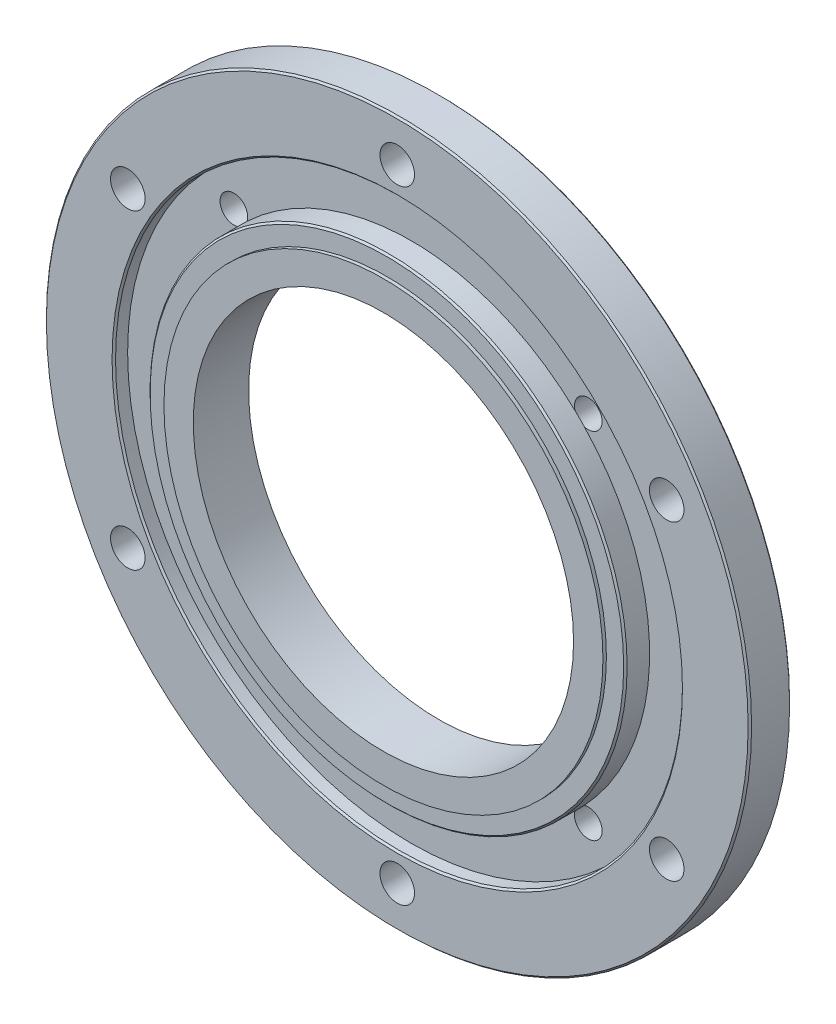
ISO-10303-21;
HEADER;
FILE_DESCRIPTION(('STEP AP214'),'2;1');
FILE_NAME('part.step','',(''),(''),'','','');
FILE_SCHEMA(('AUTOMOTIVE_DESIGN { 1 0 10303 214 1 1 1 1 }'));
ENDSEC;
DATA;
#1=APPLICATION_CONTEXT('core data for automotive mechanical design processes');
#2=APPLICATION_PROTOCOL_DEFINITION('international standard','automotive_design',2000,#1);
#3=PRODUCT_CONTEXT('',#1,'mechanical');
#4=PRODUCT('Part','Part','',(#3));
#5=PRODUCT_RELATED_PRODUCT_CATEGORY('part','',(#4));
#6=PRODUCT_DEFINITION_FORMATION('','',#4);
#7=PRODUCT_DEFINITION_CONTEXT('part definition',#1,'design');
#8=PRODUCT_DEFINITION('design','',#6,#7);
#9=PRODUCT_DEFINITION_SHAPE('','',#8);
#10=(LENGTH_UNIT() NAMED_UNIT(*) SI_UNIT(.MILLI.,.METRE.));
#11=(NAMED_UNIT(*) PLANE_ANGLE_UNIT() SI_UNIT($,.RADIAN.));
#12=(NAMED_UNIT(*) SI_UNIT($,.STERADIAN.) SOLID_ANGLE_UNIT());
#13=UNCERTAINTY_MEASURE_WITH_UNIT(LENGTH_MEASURE(1.E-05),#10,'distance_accuracy_value','');
#14=(GEOMETRIC_REPRESENTATION_CONTEXT(3) GLOBAL_UNCERTAINTY_ASSIGNED_CONTEXT((#13)) GLOBAL_UNIT_ASSIGNED_CONTEXT((#10,
#11,#12)) REPRESENTATION_CONTEXT('',''));
#15=CARTESIAN_POINT('',(0.,0.,0.));
#16=DIRECTION('',(0.,0.,1.));
#17=DIRECTION('',(1.,0.,0.));
#18=AXIS2_PLACEMENT_3D('',#15,#16,#17);
#19=CARTESIAN_POINT('',(0.,0.,12.));
#20=DIRECTION('',(0.,0.,-1.));
#21=DIRECTION('',(-1.,0.,0.));
#22=AXIS2_PLACEMENT_3D('',#19,#20,#21);
#23=CYLINDRICAL_SURFACE('',#22,102.);
#24=CARTESIAN_POINT('',(0.,0.,0.500000000000028));
#25=DIRECTION('',(0.,0.,1.));
#26=DIRECTION('',(1.,0.,0.));
#27=AXIS2_PLACEMENT_3D('',#24,#25,#26);
#28=CIRCLE('',#27,102.);
#29=CARTESIAN_POINT('',(102.,0.,0.500000000000028));
#30=VERTEX_POINT('',#29);
#31=EDGE_CURVE('E130',#30,#30,#28,.T.);
#32=ORIENTED_EDGE('',*,*,#31,.T.);
#33=EDGE_LOOP('',(#32));
#34=FACE_BOUND('',#33,.T.);
#35=CARTESIAN_POINT('',(0.,0.,11.5));
#36=DIRECTION('',(0.,0.,1.));
#37=DIRECTION('',(1.,0.,0.));
#38=AXIS2_PLACEMENT_3D('',#35,#36,#37);
#39=CIRCLE('',#38,102.);
#40=CARTESIAN_POINT('',(102.,0.,11.5));
#41=VERTEX_POINT('',#40);
#42=EDGE_CURVE('E127',#41,#41,#39,.F.);
#43=ORIENTED_EDGE('',*,*,#42,.T.);
#44=EDGE_LOOP('',(#43));
#45=FACE_BOUND('',#44,.T.);
#46=ADVANCED_FACE('F37',(#34,#45),#23,.T.);
#47=CARTESIAN_POINT('',(0.,0.,12.));
#48=DIRECTION('',(0.,0.,1.));
#49=DIRECTION('',(1.,0.,0.));
#50=AXIS2_PLACEMENT_3D('',#47,#48,#49);
#51=PLANE('',#50);
#52=CARTESIAN_POINT('',(0.,0.,12.));
#53=DIRECTION('',(0.,0.,1.));
#54=DIRECTION('',(1.,0.,0.));
#55=AXIS2_PLACEMENT_3D('',#52,#53,#54);
#56=CIRCLE('',#55,82.5);
#57=CARTESIAN_POINT('',(82.5,0.,12.));
#58=VERTEX_POINT('',#57);
#59=EDGE_CURVE('E142',#58,#58,#56,.F.);
#60=ORIENTED_EDGE('',*,*,#59,.T.);
#61=EDGE_LOOP('',(#60));
#62=FACE_BOUND('',#61,.T.);
#63=CARTESIAN_POINT('',(0.,0.,12.));
#64=DIRECTION('',(0.,0.,1.));
#65=DIRECTION('',(1.,0.,0.));
#66=AXIS2_PLACEMENT_3D('',#63,#64,#65);
#67=CIRCLE('',#66,101.5);
#68=CARTESIAN_POINT('',(101.5,0.,12.));
#69=VERTEX_POINT('',#68);
#70=EDGE_CURVE('E139',#69,#69,#67,.T.);
#71=ORIENTED_EDGE('',*,*,#70,.T.);
#72=EDGE_LOOP('',(#71));
#73=FACE_BOUND('',#72,.T.);
#74=CARTESIAN_POINT('',(77.9422863405993,-45.0000000000003,12.));
#75=DIRECTION('',(0.,0.,1.));
#76=DIRECTION('',(1.,0.,0.));
#77=AXIS2_PLACEMENT_3D('',#74,#75,#76);
#78=CIRCLE('',#77,4.99999999999999);
#79=CARTESIAN_POINT('',(82.9422863405993,-45.0000000000003,12.));
#80=VERTEX_POINT('',#79);
#81=EDGE_CURVE('E344',#80,#80,#78,.T.);
#82=ORIENTED_EDGE('',*,*,#81,.F.);
#83=EDGE_LOOP('',(#82));
#84=FACE_BOUND('',#83,.T.);
#85=CARTESIAN_POINT('',(-2.70616862252382E-13,-90.,12.));
#86=DIRECTION('',(0.,0.,1.));
#87=DIRECTION('',(1.,0.,0.));
#88=AXIS2_PLACEMENT_3D('',#85,#86,#87);
#89=CIRCLE('',#88,5.00000000000001);
#90=CARTESIAN_POINT('',(4.99999999999974,-90.,12.));
#91=VERTEX_POINT('',#90);
#92=EDGE_CURVE('E341',#91,#91,#89,.T.);
#93=ORIENTED_EDGE('',*,*,#92,.F.);
#94=EDGE_LOOP('',(#93));
#95=FACE_BOUND('',#94,.T.);
#96=CARTESIAN_POINT('',(-77.9422863405996,-44.9999999999998,12.));
#97=DIRECTION('',(0.,0.,1.));
#98=DIRECTION('',(1.,0.,0.));
#99=AXIS2_PLACEMENT_3D('',#96,#97,#98);
#100=CIRCLE('',#99,5.00000000000001);
#101=CARTESIAN_POINT('',(-72.9422863405996,-44.9999999999998,12.));
#102=VERTEX_POINT('',#101);
#103=EDGE_CURVE('E338',#102,#102,#100,.T.);
#104=ORIENTED_EDGE('',*,*,#103,.F.);
#105=EDGE_LOOP('',(#104));
#106=FACE_BOUND('',#105,.T.);
#107=CARTESIAN_POINT('',(-77.9422863405994,45.0000000000002,12.));
#108=DIRECTION('',(0.,0.,1.));
#109=DIRECTION('',(1.,0.,0.));
#110=AXIS2_PLACEMENT_3D('',#107,#108,#109);
#111=CIRCLE('',#110,5.00000000000001);
#112=CARTESIAN_POINT('',(-72.9422863405994,45.0000000000002,12.));
#113=VERTEX_POINT('',#112);
#114=EDGE_CURVE('E335',#113,#113,#111,.T.);
#115=ORIENTED_EDGE('',*,*,#114,.F.);
#116=EDGE_LOOP('',(#115));
#117=FACE_BOUND('',#116,.T.);
#118=CARTESIAN_POINT('',(2.63677968348475E-13,90.,12.));
#119=DIRECTION('',(0.,0.,1.));
#120=DIRECTION('',(1.,0.,0.));
#121=AXIS2_PLACEMENT_3D('',#118,#119,#120);
#122=CIRCLE('',#121,5.00000000000001);
#123=CARTESIAN_POINT('',(5.00000000000027,90.,12.));
#124=VERTEX_POINT('',#123);
#125=EDGE_CURVE('E323',#124,#124,#122,.T.);
#126=ORIENTED_EDGE('',*,*,#125,.F.);
#127=EDGE_LOOP('',(#126));
#128=FACE_BOUND('',#127,.T.);
#129=CARTESIAN_POINT('',(77.9422863405996,44.9999999999998,12.));
#130=DIRECTION('',(0.,0.,1.));
#131=DIRECTION('',(1.,0.,0.));
#132=AXIS2_PLACEMENT_3D('',#129,#130,#131);
#133=CIRCLE('',#132,5.00000000000003);
#134=CARTESIAN_POINT('',(82.9422863405996,44.9999999999998,12.));
#135=VERTEX_POINT('',#134);
#136=EDGE_CURVE('E325',#135,#135,#133,.T.);
#137=ORIENTED_EDGE('',*,*,#136,.F.);
#138=EDGE_LOOP('',(#137));
#139=FACE_BOUND('',#138,.T.);
#140=ADVANCED_FACE('F165',(#62,#73,#84,#95,#106,#117,#128,#139),#51,.T.);
#141=CARTESIAN_POINT('',(0.,0.,0.));
#142=DIRECTION('',(0.,0.,1.));
#143=DIRECTION('',(1.,0.,0.));
#144=AXIS2_PLACEMENT_3D('',#141,#142,#143);
#145=PLANE('',#144);
#146=CARTESIAN_POINT('',(0.,0.,0.));
#147=DIRECTION('',(0.,0.,1.));
#148=DIRECTION('',(1.,0.,0.));
#149=AXIS2_PLACEMENT_3D('',#146,#147,#148);
#150=CIRCLE('',#149,101.5);
#151=CARTESIAN_POINT('',(101.5,0.,0.));
#152=VERTEX_POINT('',#151);
#153=EDGE_CURVE('E133',#152,#152,#150,.F.);
#154=ORIENTED_EDGE('',*,*,#153,.T.);
#155=EDGE_LOOP('',(#154));
#156=FACE_BOUND('',#155,.T.);
#157=CARTESIAN_POINT('',(77.9422863405993,-45.0000000000003,0.));
#158=DIRECTION('',(0.,0.,-1.));
#159=DIRECTION('',(-1.,0.,0.));
#160=AXIS2_PLACEMENT_3D('',#157,#158,#159);
#161=CIRCLE('',#160,4.99999999999999);
#162=CARTESIAN_POINT('',(72.9422863405994,-45.0000000000003,0.));
#163=VERTEX_POINT('',#162);
#164=EDGE_CURVE('E205',#163,#163,#161,.T.);
#165=ORIENTED_EDGE('',*,*,#164,.F.);
#166=EDGE_LOOP('',(#165));
#167=FACE_BOUND('',#166,.T.);
#168=CARTESIAN_POINT('',(-2.70616862252382E-13,-90.,0.));
#169=DIRECTION('',(0.,0.,-1.));
#170=DIRECTION('',(-1.,0.,0.));
#171=AXIS2_PLACEMENT_3D('',#168,#169,#170);
#172=CIRCLE('',#171,5.00000000000001);
#173=CARTESIAN_POINT('',(-5.00000000000028,-90.,0.));
#174=VERTEX_POINT('',#173);
#175=EDGE_CURVE('E209',#174,#174,#172,.T.);
#176=ORIENTED_EDGE('',*,*,#175,.F.);
#177=EDGE_LOOP('',(#176));
#178=FACE_BOUND('',#177,.T.);
#179=CARTESIAN_POINT('',(-77.9422863405996,-44.9999999999998,0.));
#180=DIRECTION('',(0.,0.,-1.));
#181=DIRECTION('',(-1.,0.,0.));
#182=AXIS2_PLACEMENT_3D('',#179,#180,#181);
#183=CIRCLE('',#182,5.00000000000001);
#184=CARTESIAN_POINT('',(-82.9422863405996,-44.9999999999998,0.));
#185=VERTEX_POINT('',#184);
#186=EDGE_CURVE('E213',#185,#185,#183,.T.);
#187=ORIENTED_EDGE('',*,*,#186,.F.);
#188=EDGE_LOOP('',(#187));
#189=FACE_BOUND('',#188,.T.);
#190=CARTESIAN_POINT('',(-77.9422863405994,45.0000000000002,0.));
#191=DIRECTION('',(0.,0.,-1.));
#192=DIRECTION('',(-1.,0.,0.));
#193=AXIS2_PLACEMENT_3D('',#190,#191,#192);
#194=CIRCLE('',#193,5.00000000000001);
#195=CARTESIAN_POINT('',(-82.9422863405994,45.0000000000002,0.));
#196=VERTEX_POINT('',#195);
#197=EDGE_CURVE('E217',#196,#196,#194,.T.);
#198=ORIENTED_EDGE('',*,*,#197,.F.);
#199=EDGE_LOOP('',(#198));
#200=FACE_BOUND('',#199,.T.);
#201=CARTESIAN_POINT('',(2.63677968348475E-13,90.,0.));
#202=DIRECTION('',(0.,0.,-1.));
#203=DIRECTION('',(-1.,0.,0.));
#204=AXIS2_PLACEMENT_3D('',#201,#202,#203);
#205=CIRCLE('',#204,5.00000000000001);
#206=CARTESIAN_POINT('',(-4.99999999999974,90.,0.));
#207=VERTEX_POINT('',#206);
#208=EDGE_CURVE('E221',#207,#207,#205,.T.);
#209=ORIENTED_EDGE('',*,*,#208,.F.);
#210=EDGE_LOOP('',(#209));
#211=FACE_BOUND('',#210,.T.);
#212=CARTESIAN_POINT('',(77.9422863405996,44.9999999999998,0.));
#213=DIRECTION('',(0.,0.,-1.));
#214=DIRECTION('',(-1.,0.,0.));
#215=AXIS2_PLACEMENT_3D('',#212,#213,#214);
#216=CIRCLE('',#215,5.00000000000003);
#217=CARTESIAN_POINT('',(72.9422863405996,44.9999999999998,0.));
#218=VERTEX_POINT('',#217);
#219=EDGE_CURVE('E225',#218,#218,#216,.T.);
#220=ORIENTED_EDGE('',*,*,#219,.F.);
#221=EDGE_LOOP('',(#220));
#222=FACE_BOUND('',#221,.T.);
#223=CARTESIAN_POINT('',(-51.2652416360248,-51.2652416360246,0.));
#224=DIRECTION('',(0.,0.,1.));
#225=DIRECTION('',(-1.,0.,0.));
#226=AXIS2_PLACEMENT_3D('',#223,#224,#225);
#227=CIRCLE('',#226,4.);
#228=CARTESIAN_POINT('',(-55.2652416360248,-51.2652416360246,0.));
#229=VERTEX_POINT('',#228);
#230=EDGE_CURVE('E229',#229,#229,#227,.T.);
#231=ORIENTED_EDGE('',*,*,#230,.T.);
#232=EDGE_LOOP('',(#231));
#233=FACE_BOUND('',#232,.T.);
#234=CARTESIAN_POINT('',(51.2652416360248,-51.2652416360246,0.));
#235=DIRECTION('',(0.,0.,1.));
#236=DIRECTION('',(1.,0.,0.));
#237=AXIS2_PLACEMENT_3D('',#234,#235,#236);
#238=CIRCLE('',#237,4.);
#239=CARTESIAN_POINT('',(55.2652416360248,-51.2652416360246,0.));
#240=VERTEX_POINT('',#239);
#241=EDGE_CURVE('E233',#240,#240,#238,.T.);
#242=ORIENTED_EDGE('',*,*,#241,.T.);
#243=EDGE_LOOP('',(#242));
#244=FACE_BOUND('',#243,.T.);
#245=CARTESIAN_POINT('',(51.2652416360248,51.2652416360246,0.));
#246=DIRECTION('',(0.,0.,1.));
#247=DIRECTION('',(-1.,0.,0.));
#248=AXIS2_PLACEMENT_3D('',#245,#246,#247);
#249=CIRCLE('',#248,4.);
#250=CARTESIAN_POINT('',(47.2652416360248,51.2652416360246,0.));
#251=VERTEX_POINT('',#250);
#252=EDGE_CURVE('E237',#251,#251,#249,.T.);
#253=ORIENTED_EDGE('',*,*,#252,.T.);
#254=EDGE_LOOP('',(#253));
#255=FACE_BOUND('',#254,.T.);
#256=CARTESIAN_POINT('',(-51.2652416360248,51.2652416360246,0.));
#257=DIRECTION('',(0.,0.,1.));
#258=DIRECTION('',(1.,0.,0.));
#259=AXIS2_PLACEMENT_3D('',#256,#257,#258);
#260=CIRCLE('',#259,4.);
#261=CARTESIAN_POINT('',(-47.2652416360248,51.2652416360246,0.));
#262=VERTEX_POINT('',#261);
#263=EDGE_CURVE('E88',#262,#262,#260,.T.);
#264=ORIENTED_EDGE('',*,*,#263,.T.);
#265=EDGE_LOOP('',(#264));
#266=FACE_BOUND('',#265,.T.);
#267=CARTESIAN_POINT('',(0.,0.,0.));
#268=DIRECTION('',(0.,0.,1.));
#269=DIRECTION('',(1.,0.,0.));
#270=AXIS2_PLACEMENT_3D('',#267,#268,#269);
#271=CIRCLE('',#270,55.);
#272=CARTESIAN_POINT('',(55.,0.,0.));
#273=VERTEX_POINT('',#272);
#274=EDGE_CURVE('E116',#273,#273,#271,.T.);
#275=ORIENTED_EDGE('',*,*,#274,.T.);
#276=EDGE_LOOP('',(#275));
#277=FACE_BOUND('',#276,.T.);
#278=ADVANCED_FACE('F171',(#156,#167,#178,#189,#200,#211,#222,#233,#244,#255,#266,#277),#145,.F.);
#279=CARTESIAN_POINT('',(0.,0.,15.));
#280=DIRECTION('',(0.,0.,-1.));
#281=DIRECTION('',(-1.,0.,0.));
#282=AXIS2_PLACEMENT_3D('',#279,#280,#281);
#283=CYLINDRICAL_SURFACE('',#282,69.);
#284=CARTESIAN_POINT('',(0.,0.,14.5));
#285=DIRECTION('',(0.,0.,1.));
#286=DIRECTION('',(1.,0.,0.));
#287=AXIS2_PLACEMENT_3D('',#284,#285,#286);
#288=CIRCLE('',#287,69.);
#289=CARTESIAN_POINT('',(69.,0.,14.5));
#290=VERTEX_POINT('',#289);
#291=EDGE_CURVE('E11',#290,#290,#288,.F.);
#292=ORIENTED_EDGE('',*,*,#291,.T.);
#293=EDGE_LOOP('',(#292));
#294=FACE_BOUND('',#293,.T.);
#295=CARTESIAN_POINT('',(0.,0.,8.));
#296=DIRECTION('',(0.,0.,1.));
#297=DIRECTION('',(1.,0.,0.));
#298=AXIS2_PLACEMENT_3D('',#295,#296,#297);
#299=CIRCLE('',#298,69.);
#300=CARTESIAN_POINT('',(50.1078008135945,47.4363605014669,8.));
#301=VERTEX_POINT('',#300);
#302=CARTESIAN_POINT('',(47.4363605014671,50.1078008135943,8.));
#303=VERTEX_POINT('',#302);
#304=EDGE_CURVE('E109',#301,#303,#299,.T.);
#305=ORIENTED_EDGE('',*,*,#304,.T.);
#306=CARTESIAN_POINT('',(-47.4363605014671,50.1078008135943,8.));
#307=VERTEX_POINT('',#306);
#308=EDGE_CURVE('E108',#303,#307,#299,.T.);
#309=ORIENTED_EDGE('',*,*,#308,.T.);
#310=CARTESIAN_POINT('',(-50.1078008135945,47.4363605014669,8.));
#311=VERTEX_POINT('',#310);
#312=EDGE_CURVE('E93',#307,#311,#299,.T.);
#313=ORIENTED_EDGE('',*,*,#312,.T.);
#314=CARTESIAN_POINT('',(-50.1078008135945,-47.4363605014669,8.));
#315=VERTEX_POINT('',#314);
#316=EDGE_CURVE('E97',#311,#315,#299,.T.);
#317=ORIENTED_EDGE('',*,*,#316,.T.);
#318=CARTESIAN_POINT('',(-47.4363605014671,-50.1078008135943,8.));
#319=VERTEX_POINT('',#318);
#320=EDGE_CURVE('E104',#315,#319,#299,.T.);
#321=ORIENTED_EDGE('',*,*,#320,.T.);
#322=CARTESIAN_POINT('',(47.4363605014671,-50.1078008135943,8.));
#323=VERTEX_POINT('',#322);
#324=EDGE_CURVE('E358',#319,#323,#299,.T.);
#325=ORIENTED_EDGE('',*,*,#324,.T.);
#326=CARTESIAN_POINT('',(50.1078008135945,-47.4363605014669,8.));
#327=VERTEX_POINT('',#326);
#328=EDGE_CURVE('E361',#323,#327,#299,.T.);
#329=ORIENTED_EDGE('',*,*,#328,.T.);
#330=EDGE_CURVE('E94',#327,#301,#299,.T.);
#331=ORIENTED_EDGE('',*,*,#330,.T.);
#332=EDGE_LOOP('',(#305,#309,#313,#317,#321,#325,#329,#331));
#333=FACE_BOUND('',#332,.T.);
#334=ADVANCED_FACE('F107',(#294,#333),#283,.T.);
#335=CARTESIAN_POINT('',(0.,0.,15.));
#336=DIRECTION('',(0.,0.,1.));
#337=DIRECTION('',(1.,0.,0.));
#338=AXIS2_PLACEMENT_3D('',#335,#336,#337);
#339=PLANE('',#338);
#340=CARTESIAN_POINT('',(0.,0.,15.));
#341=DIRECTION('',(0.,0.,1.));
#342=DIRECTION('',(1.,0.,0.));
#343=AXIS2_PLACEMENT_3D('',#340,#341,#342);
#344=CIRCLE('',#343,68.5);
#345=CARTESIAN_POINT('',(68.5,0.,15.));
#346=VERTEX_POINT('',#345);
#347=EDGE_CURVE('E46',#346,#346,#344,.T.);
#348=ORIENTED_EDGE('',*,*,#347,.T.);
#349=EDGE_LOOP('',(#348));
#350=FACE_BOUND('',#349,.T.);
#351=CARTESIAN_POINT('',(0.,0.,15.));
#352=DIRECTION('',(0.,0.,1.));
#353=DIRECTION('',(1.,0.,0.));
#354=AXIS2_PLACEMENT_3D('',#351,#352,#353);
#355=CIRCLE('',#354,63.5);
#356=CARTESIAN_POINT('',(63.5,0.,15.));
#357=VERTEX_POINT('',#356);
#358=EDGE_CURVE('E124',#357,#357,#355,.T.);
#359=ORIENTED_EDGE('',*,*,#358,.F.);
#360=EDGE_LOOP('',(#359));
#361=FACE_BOUND('',#360,.T.);
#362=ADVANCED_FACE('F147',(#350,#361),#339,.T.);
#363=CARTESIAN_POINT('',(0.,0.,16.));
#364=DIRECTION('',(0.,0.,-1.));
#365=DIRECTION('',(-1.,0.,0.));
#366=AXIS2_PLACEMENT_3D('',#363,#364,#365);
#367=CYLINDRICAL_SURFACE('',#366,63.5);
#368=CARTESIAN_POINT('',(0.,0.,16.));
#369=DIRECTION('',(0.,0.,1.));
#370=DIRECTION('',(1.,0.,0.));
#371=AXIS2_PLACEMENT_3D('',#368,#369,#370);
#372=CIRCLE('',#371,63.5);
#373=CARTESIAN_POINT('',(63.5,0.,16.));
#374=VERTEX_POINT('',#373);
#375=EDGE_CURVE('E119',#374,#374,#372,.T.);
#376=ORIENTED_EDGE('',*,*,#375,.F.);
#377=EDGE_LOOP('',(#376));
#378=FACE_BOUND('',#377,.T.);
#379=ORIENTED_EDGE('',*,*,#358,.T.);
#380=EDGE_LOOP('',(#379));
#381=FACE_BOUND('',#380,.T.);
#382=ADVANCED_FACE('F253',(#378,#381),#367,.T.);
#383=CARTESIAN_POINT('',(0.,0.,16.));
#384=DIRECTION('',(0.,0.,1.));
#385=DIRECTION('',(1.,0.,0.));
#386=AXIS2_PLACEMENT_3D('',#383,#384,#385);
#387=PLANE('',#386);
#388=CARTESIAN_POINT('',(0.,0.,16.));
#389=DIRECTION('',(0.,0.,1.));
#390=DIRECTION('',(1.,0.,0.));
#391=AXIS2_PLACEMENT_3D('',#388,#389,#390);
#392=CIRCLE('',#391,55.);
#393=CARTESIAN_POINT('',(55.,0.,16.));
#394=VERTEX_POINT('',#393);
#395=EDGE_CURVE('E115',#394,#394,#392,.T.);
#396=ORIENTED_EDGE('',*,*,#395,.F.);
#397=EDGE_LOOP('',(#396));
#398=FACE_BOUND('',#397,.T.);
#399=ORIENTED_EDGE('',*,*,#375,.T.);
#400=EDGE_LOOP('',(#399));
#401=FACE_BOUND('',#400,.T.);
#402=ADVANCED_FACE('F247',(#398,#401),#387,.T.);
#403=CARTESIAN_POINT('',(0.,0.,0.));
#404=DIRECTION('',(0.,0.,1.));
#405=DIRECTION('',(1.,0.,0.));
#406=AXIS2_PLACEMENT_3D('',#403,#404,#405);
#407=CYLINDRICAL_SURFACE('',#406,55.);
#408=ORIENTED_EDGE('',*,*,#274,.F.);
#409=EDGE_LOOP('',(#408));
#410=FACE_BOUND('',#409,.T.);
#411=ORIENTED_EDGE('',*,*,#395,.T.);
#412=EDGE_LOOP('',(#411));
#413=FACE_BOUND('',#412,.T.);
#414=ADVANCED_FACE('F243',(#410,#413),#407,.F.);
#415=CARTESIAN_POINT('',(0.,0.,8.));
#416=DIRECTION('',(0.,0.,1.));
#417=DIRECTION('',(1.,0.,0.));
#418=AXIS2_PLACEMENT_3D('',#415,#416,#417);
#419=CYLINDRICAL_SURFACE('',#418,82.);
#420=CARTESIAN_POINT('',(0.,0.,11.5));
#421=DIRECTION('',(0.,0.,1.));
#422=DIRECTION('',(1.,0.,0.));
#423=AXIS2_PLACEMENT_3D('',#420,#421,#422);
#424=CIRCLE('',#423,82.);
#425=CARTESIAN_POINT('',(82.,0.,11.5));
#426=VERTEX_POINT('',#425);
#427=EDGE_CURVE('E136',#426,#426,#424,.T.);
#428=ORIENTED_EDGE('',*,*,#427,.T.);
#429=EDGE_LOOP('',(#428));
#430=FACE_BOUND('',#429,.T.);
#431=CARTESIAN_POINT('',(0.,0.,8.));
#432=DIRECTION('',(0.,0.,1.));
#433=DIRECTION('',(1.,0.,0.));
#434=AXIS2_PLACEMENT_3D('',#431,#432,#433);
#435=CIRCLE('',#434,82.);
#436=CARTESIAN_POINT('',(82.,0.,8.));
#437=VERTEX_POINT('',#436);
#438=EDGE_CURVE('E112',#437,#437,#435,.T.);
#439=ORIENTED_EDGE('',*,*,#438,.F.);
#440=EDGE_LOOP('',(#439));
#441=FACE_BOUND('',#440,.T.);
#442=ADVANCED_FACE('F246',(#430,#441),#419,.F.);
#443=CARTESIAN_POINT('',(0.,0.,8.));
#444=DIRECTION('',(0.,0.,1.));
#445=DIRECTION('',(1.,0.,0.));
#446=AXIS2_PLACEMENT_3D('',#443,#444,#445);
#447=PLANE('',#446);
#448=CARTESIAN_POINT('',(-51.2652416360248,-51.2652416360246,8.));
#449=DIRECTION('',(0.,0.,1.));
#450=DIRECTION('',(-1.,0.,0.));
#451=AXIS2_PLACEMENT_3D('',#448,#449,#450);
#452=CIRCLE('',#451,4.);
#453=EDGE_CURVE('E101',#315,#319,#452,.T.);
#454=ORIENTED_EDGE('',*,*,#453,.F.);
#455=ORIENTED_EDGE('',*,*,#316,.F.);
#456=CARTESIAN_POINT('',(-51.2652416360248,51.2652416360246,8.));
#457=DIRECTION('',(0.,0.,1.));
#458=DIRECTION('',(1.,0.,0.));
#459=AXIS2_PLACEMENT_3D('',#456,#457,#458);
#460=CIRCLE('',#459,4.);
#461=EDGE_CURVE('E78',#307,#311,#460,.T.);
#462=ORIENTED_EDGE('',*,*,#461,.F.);
#463=ORIENTED_EDGE('',*,*,#308,.F.);
#464=CARTESIAN_POINT('',(51.2652416360248,51.2652416360246,8.));
#465=DIRECTION('',(0.,0.,1.));
#466=DIRECTION('',(-1.,0.,0.));
#467=AXIS2_PLACEMENT_3D('',#464,#465,#466);
#468=CIRCLE('',#467,4.);
#469=EDGE_CURVE('E349',#301,#303,#468,.T.);
#470=ORIENTED_EDGE('',*,*,#469,.F.);
#471=ORIENTED_EDGE('',*,*,#330,.F.);
#472=CARTESIAN_POINT('',(51.2652416360248,-51.2652416360246,8.));
#473=DIRECTION('',(0.,0.,1.));
#474=DIRECTION('',(1.,0.,0.));
#475=AXIS2_PLACEMENT_3D('',#472,#473,#474);
#476=CIRCLE('',#475,4.);
#477=EDGE_CURVE('E352',#323,#327,#476,.T.);
#478=ORIENTED_EDGE('',*,*,#477,.F.);
#479=ORIENTED_EDGE('',*,*,#324,.F.);
#480=EDGE_LOOP('',(#454,#455,#462,#463,#470,#471,#478,#479));
#481=FACE_BOUND('',#480,.T.);
#482=ORIENTED_EDGE('',*,*,#438,.T.);
#483=EDGE_LOOP('',(#482));
#484=FACE_BOUND('',#483,.T.);
#485=ADVANCED_FACE('F98',(#481,#484),#447,.T.);
#486=CARTESIAN_POINT('',(-51.2652416360248,51.2652416360246,8.));
#487=DIRECTION('',(0.,0.,1.));
#488=DIRECTION('',(1.,0.,0.));
#489=AXIS2_PLACEMENT_3D('',#486,#487,#488);
#490=PLANE('',#489);
#491=EDGE_CURVE('E82',#311,#307,#460,.T.);
#492=ORIENTED_EDGE('',*,*,#491,.F.);
#493=ORIENTED_EDGE('',*,*,#312,.F.);
#494=EDGE_LOOP('',(#492,#493));
#495=FACE_BOUND('',#494,.T.);
#496=ADVANCED_FACE('F91',(#495),#490,.F.);
#497=CARTESIAN_POINT('',(-51.2652416360248,51.2652416360246,8.));
#498=DIRECTION('',(0.,0.,-1.));
#499=DIRECTION('',(-1.,0.,0.));
#500=AXIS2_PLACEMENT_3D('',#497,#498,#499);
#501=CYLINDRICAL_SURFACE('',#500,4.);
#502=ORIENTED_EDGE('',*,*,#491,.T.);
#503=ORIENTED_EDGE('',*,*,#461,.T.);
#504=EDGE_LOOP('',(#502,#503));
#505=FACE_BOUND('',#504,.T.);
#506=ORIENTED_EDGE('',*,*,#263,.F.);
#507=EDGE_LOOP('',(#506));
#508=FACE_BOUND('',#507,.T.);
#509=ADVANCED_FACE('F80',(#505,#508),#501,.F.);
#510=CARTESIAN_POINT('',(51.2652416360248,51.2652416360246,8.));
#511=DIRECTION('',(0.,0.,-1.));
#512=DIRECTION('',(-1.,0.,0.));
#513=AXIS2_PLACEMENT_3D('',#510,#511,#512);
#514=CYLINDRICAL_SURFACE('',#513,4.);
#515=EDGE_CURVE('E347',#303,#301,#468,.T.);
#516=ORIENTED_EDGE('',*,*,#515,.T.);
#517=ORIENTED_EDGE('',*,*,#469,.T.);
#518=EDGE_LOOP('',(#516,#517));
#519=FACE_BOUND('',#518,.T.);
#520=ORIENTED_EDGE('',*,*,#252,.F.);
#521=EDGE_LOOP('',(#520));
#522=FACE_BOUND('',#521,.T.);
#523=ADVANCED_FACE('F276',(#519,#522),#514,.F.);
#524=CARTESIAN_POINT('',(51.2652416360248,51.2652416360246,8.));
#525=DIRECTION('',(0.,0.,-1.));
#526=DIRECTION('',(-1.,0.,0.));
#527=AXIS2_PLACEMENT_3D('',#524,#525,#526);
#528=PLANE('',#527);
#529=ORIENTED_EDGE('',*,*,#515,.F.);
#530=ORIENTED_EDGE('',*,*,#304,.F.);
#531=EDGE_LOOP('',(#529,#530));
#532=FACE_BOUND('',#531,.T.);
#533=ADVANCED_FACE('F293',(#532),#528,.T.);
#534=CARTESIAN_POINT('',(51.2652416360248,-51.2652416360246,8.));
#535=DIRECTION('',(0.,0.,1.));
#536=DIRECTION('',(1.,0.,0.));
#537=AXIS2_PLACEMENT_3D('',#534,#535,#536);
#538=PLANE('',#537);
#539=EDGE_CURVE('E52',#327,#323,#476,.T.);
#540=ORIENTED_EDGE('',*,*,#539,.F.);
#541=ORIENTED_EDGE('',*,*,#328,.F.);
#542=EDGE_LOOP('',(#540,#541));
#543=FACE_BOUND('',#542,.T.);
#544=ADVANCED_FACE('F290',(#543),#538,.F.);
#545=CARTESIAN_POINT('',(51.2652416360248,-51.2652416360246,8.));
#546=DIRECTION('',(0.,0.,-1.));
#547=DIRECTION('',(-1.,0.,0.));
#548=AXIS2_PLACEMENT_3D('',#545,#546,#547);
#549=CYLINDRICAL_SURFACE('',#548,4.);
#550=ORIENTED_EDGE('',*,*,#539,.T.);
#551=ORIENTED_EDGE('',*,*,#477,.T.);
#552=EDGE_LOOP('',(#550,#551));
#553=FACE_BOUND('',#552,.T.);
#554=ORIENTED_EDGE('',*,*,#241,.F.);
#555=EDGE_LOOP('',(#554));
#556=FACE_BOUND('',#555,.T.);
#557=ADVANCED_FACE('F283',(#553,#556),#549,.F.);
#558=CARTESIAN_POINT('',(-51.2652416360248,-51.2652416360246,8.));
#559=DIRECTION('',(0.,0.,-1.));
#560=DIRECTION('',(-1.,0.,0.));
#561=AXIS2_PLACEMENT_3D('',#558,#559,#560);
#562=CYLINDRICAL_SURFACE('',#561,4.);
#563=EDGE_CURVE('E59',#319,#315,#452,.T.);
#564=ORIENTED_EDGE('',*,*,#563,.T.);
#565=ORIENTED_EDGE('',*,*,#453,.T.);
#566=EDGE_LOOP('',(#564,#565));
#567=FACE_BOUND('',#566,.T.);
#568=ORIENTED_EDGE('',*,*,#230,.F.);
#569=EDGE_LOOP('',(#568));
#570=FACE_BOUND('',#569,.T.);
#571=ADVANCED_FACE('F279',(#567,#570),#562,.F.);
#572=CARTESIAN_POINT('',(-51.2652416360248,-51.2652416360246,8.));
#573=DIRECTION('',(0.,0.,-1.));
#574=DIRECTION('',(-1.,0.,0.));
#575=AXIS2_PLACEMENT_3D('',#572,#573,#574);
#576=PLANE('',#575);
#577=ORIENTED_EDGE('',*,*,#563,.F.);
#578=ORIENTED_EDGE('',*,*,#320,.F.);
#579=EDGE_LOOP('',(#577,#578));
#580=FACE_BOUND('',#579,.T.);
#581=ADVANCED_FACE('F282',(#580),#576,.T.);
#582=CARTESIAN_POINT('',(77.9422863405996,44.9999999999998,16.));
#583=DIRECTION('',(0.,0.,-1.));
#584=DIRECTION('',(-1.,0.,0.));
#585=AXIS2_PLACEMENT_3D('',#582,#583,#584);
#586=CYLINDRICAL_SURFACE('',#585,5.00000000000003);
#587=ORIENTED_EDGE('',*,*,#136,.T.);
#588=EDGE_LOOP('',(#587));
#589=FACE_BOUND('',#588,.T.);
#590=ORIENTED_EDGE('',*,*,#219,.T.);
#591=EDGE_LOOP('',(#590));
#592=FACE_BOUND('',#591,.T.);
#593=ADVANCED_FACE('F286',(#589,#592),#586,.F.);
#594=CARTESIAN_POINT('',(2.63677968348475E-13,90.,16.));
#595=DIRECTION('',(0.,0.,-1.));
#596=DIRECTION('',(-1.,0.,0.));
#597=AXIS2_PLACEMENT_3D('',#594,#595,#596);
#598=CYLINDRICAL_SURFACE('',#597,5.00000000000001);
#599=ORIENTED_EDGE('',*,*,#125,.T.);
#600=EDGE_LOOP('',(#599));
#601=FACE_BOUND('',#600,.T.);
#602=ORIENTED_EDGE('',*,*,#208,.T.);
#603=EDGE_LOOP('',(#602));
#604=FACE_BOUND('',#603,.T.);
#605=ADVANCED_FACE('F302',(#601,#604),#598,.F.);
#606=CARTESIAN_POINT('',(-77.9422863405994,45.0000000000002,16.));
#607=DIRECTION('',(0.,0.,-1.));
#608=DIRECTION('',(-1.,0.,0.));
#609=AXIS2_PLACEMENT_3D('',#606,#607,#608);
#610=CYLINDRICAL_SURFACE('',#609,5.00000000000001);
#611=ORIENTED_EDGE('',*,*,#114,.T.);
#612=EDGE_LOOP('',(#611));
#613=FACE_BOUND('',#612,.T.);
#614=ORIENTED_EDGE('',*,*,#197,.T.);
#615=EDGE_LOOP('',(#614));
#616=FACE_BOUND('',#615,.T.);
#617=ADVANCED_FACE('F311',(#613,#616),#610,.F.);
#618=CARTESIAN_POINT('',(-77.9422863405996,-44.9999999999998,16.));
#619=DIRECTION('',(0.,0.,-1.));
#620=DIRECTION('',(-1.,0.,0.));
#621=AXIS2_PLACEMENT_3D('',#618,#619,#620);
#622=CYLINDRICAL_SURFACE('',#621,5.00000000000001);
#623=ORIENTED_EDGE('',*,*,#103,.T.);
#624=EDGE_LOOP('',(#623));
#625=FACE_BOUND('',#624,.T.);
#626=ORIENTED_EDGE('',*,*,#186,.T.);
#627=EDGE_LOOP('',(#626));
#628=FACE_BOUND('',#627,.T.);
#629=ADVANCED_FACE('F307',(#625,#628),#622,.F.);
#630=CARTESIAN_POINT('',(-2.70616862252382E-13,-90.,16.));
#631=DIRECTION('',(0.,0.,-1.));
#632=DIRECTION('',(-1.,0.,0.));
#633=AXIS2_PLACEMENT_3D('',#630,#631,#632);
#634=CYLINDRICAL_SURFACE('',#633,5.00000000000001);
#635=ORIENTED_EDGE('',*,*,#92,.T.);
#636=EDGE_LOOP('',(#635));
#637=FACE_BOUND('',#636,.T.);
#638=ORIENTED_EDGE('',*,*,#175,.T.);
#639=EDGE_LOOP('',(#638));
#640=FACE_BOUND('',#639,.T.);
#641=ADVANCED_FACE('F193',(#637,#640),#634,.F.);
#642=CARTESIAN_POINT('',(77.9422863405993,-45.0000000000003,16.));
#643=DIRECTION('',(0.,0.,-1.));
#644=DIRECTION('',(-1.,0.,0.));
#645=AXIS2_PLACEMENT_3D('',#642,#643,#644);
#646=CYLINDRICAL_SURFACE('',#645,4.99999999999999);
#647=ORIENTED_EDGE('',*,*,#81,.T.);
#648=EDGE_LOOP('',(#647));
#649=FACE_BOUND('',#648,.T.);
#650=ORIENTED_EDGE('',*,*,#164,.T.);
#651=EDGE_LOOP('',(#650));
#652=FACE_BOUND('',#651,.T.);
#653=ADVANCED_FACE('F182',(#649,#652),#646,.F.);
#654=CARTESIAN_POINT('',(0.,0.,0.500000000000028));
#655=DIRECTION('',(0.,0.,1.));
#656=DIRECTION('',(1.,0.,0.));
#657=AXIS2_PLACEMENT_3D('',#654,#655,#656);
#658=CONICAL_SURFACE('',#657,102.,0.785398163397421);
#659=ORIENTED_EDGE('',*,*,#153,.F.);
#660=EDGE_LOOP('',(#659));
#661=FACE_BOUND('',#660,.T.);
#662=ORIENTED_EDGE('',*,*,#31,.F.);
#663=EDGE_LOOP('',(#662));
#664=FACE_BOUND('',#663,.T.);
#665=ADVANCED_FACE('F159',(#661,#664),#658,.T.);
#666=CARTESIAN_POINT('',(0.,0.,11.5));
#667=DIRECTION('',(0.,0.,1.));
#668=DIRECTION('',(1.,0.,0.));
#669=AXIS2_PLACEMENT_3D('',#666,#667,#668);
#670=CONICAL_SURFACE('',#669,82.,0.785398163397448);
#671=ORIENTED_EDGE('',*,*,#59,.F.);
#672=EDGE_LOOP('',(#671));
#673=FACE_BOUND('',#672,.T.);
#674=ORIENTED_EDGE('',*,*,#427,.F.);
#675=EDGE_LOOP('',(#674));
#676=FACE_BOUND('',#675,.T.);
#677=ADVANCED_FACE('F152',(#673,#676),#670,.F.);
#678=CARTESIAN_POINT('',(0.,0.,15.));
#679=DIRECTION('',(0.,0.,-1.));
#680=DIRECTION('',(-1.,0.,0.));
#681=AXIS2_PLACEMENT_3D('',#678,#679,#680);
#682=CONICAL_SURFACE('',#681,68.5,0.785398163397448);
#683=ORIENTED_EDGE('',*,*,#291,.F.);
#684=EDGE_LOOP('',(#683));
#685=FACE_BOUND('',#684,.T.);
#686=ORIENTED_EDGE('',*,*,#347,.F.);
#687=EDGE_LOOP('',(#686));
#688=FACE_BOUND('',#687,.T.);
#689=ADVANCED_FACE('F150',(#685,#688),#682,.T.);
#690=CARTESIAN_POINT('',(0.,0.,12.));
#691=DIRECTION('',(0.,0.,-1.));
#692=DIRECTION('',(-1.,0.,0.));
#693=AXIS2_PLACEMENT_3D('',#690,#691,#692);
#694=CONICAL_SURFACE('',#693,101.5,0.785398163397462);
#695=ORIENTED_EDGE('',*,*,#42,.F.);
#696=EDGE_LOOP('',(#695));
#697=FACE_BOUND('',#696,.T.);
#698=ORIENTED_EDGE('',*,*,#70,.F.);
#699=EDGE_LOOP('',(#698));
#700=FACE_BOUND('',#699,.T.);
#701=ADVANCED_FACE('F40',(#697,#700),#694,.T.);
#702=CLOSED_SHELL('',(#46,#140,#278,#334,#362,#382,#402,#414,#442,#485,#496,#509,#523,#533,#544,
#557,#571,#581,#593,#605,#617,#629,#641,#653,#665,#677,#689,#701));
#703=MANIFOLD_SOLID_BREP('B2',#702);
#704=ADVANCED_BREP_SHAPE_REPRESENTATION('',(#18,#703),#14);
#705=SHAPE_DEFINITION_REPRESENTATION(#9,#704);
ENDSEC;
END-ISO-10303-21;
